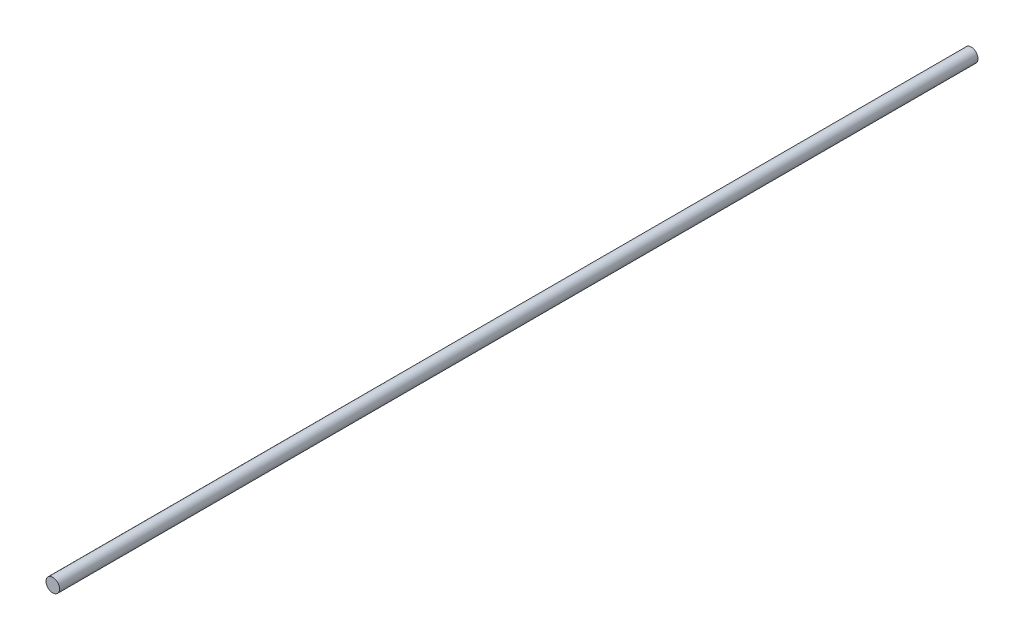
ISO-10303-21;
HEADER;
FILE_DESCRIPTION(('STEP AP214'),'2;1');
FILE_NAME('part.step','',(''),(''),'','','');
FILE_SCHEMA(('AUTOMOTIVE_DESIGN { 1 0 10303 214 1 1 1 1 }'));
ENDSEC;
DATA;
#1=APPLICATION_CONTEXT('core data for automotive mechanical design processes');
#2=APPLICATION_PROTOCOL_DEFINITION('international standard','automotive_design',2000,#1);
#3=PRODUCT_CONTEXT('',#1,'mechanical');
#4=PRODUCT('Part','Part','',(#3));
#5=PRODUCT_RELATED_PRODUCT_CATEGORY('part','',(#4));
#6=PRODUCT_DEFINITION_FORMATION('','',#4);
#7=PRODUCT_DEFINITION_CONTEXT('part definition',#1,'design');
#8=PRODUCT_DEFINITION('design','',#6,#7);
#9=PRODUCT_DEFINITION_SHAPE('','',#8);
#10=(LENGTH_UNIT() NAMED_UNIT(*) SI_UNIT(.MILLI.,.METRE.));
#11=(NAMED_UNIT(*) PLANE_ANGLE_UNIT() SI_UNIT($,.RADIAN.));
#12=(NAMED_UNIT(*) SI_UNIT($,.STERADIAN.) SOLID_ANGLE_UNIT());
#13=UNCERTAINTY_MEASURE_WITH_UNIT(LENGTH_MEASURE(1.E-05),#10,'distance_accuracy_value','');
#14=(GEOMETRIC_REPRESENTATION_CONTEXT(3) GLOBAL_UNCERTAINTY_ASSIGNED_CONTEXT((#13)) GLOBAL_UNIT_ASSIGNED_CONTEXT((#10,
#11,#12)) REPRESENTATION_CONTEXT('',''));
#15=CARTESIAN_POINT('',(0.,0.,0.));
#16=DIRECTION('',(0.,0.,1.));
#17=DIRECTION('',(1.,0.,0.));
#18=AXIS2_PLACEMENT_3D('',#15,#16,#17);
#19=CARTESIAN_POINT('',(-7.14018563469935,7.6610404533529,583.));
#20=DIRECTION('',(0.,0.,-1.));
#21=DIRECTION('',(-1.,0.,0.));
#22=AXIS2_PLACEMENT_3D('',#19,#20,#21);
#23=CYLINDRICAL_SURFACE('',#22,4.3);
#24=CARTESIAN_POINT('',(-7.14018563469935,7.6610404533529,583.));
#25=DIRECTION('',(0.,0.,1.));
#26=DIRECTION('',(1.,0.,0.));
#27=AXIS2_PLACEMENT_3D('',#24,#25,#26);
#28=CIRCLE('',#27,4.3);
#29=CARTESIAN_POINT('',(-2.84018563469935,7.6610404533529,583.));
#30=VERTEX_POINT('',#29);
#31=EDGE_CURVE('E10',#30,#30,#28,.T.);
#32=ORIENTED_EDGE('',*,*,#31,.F.);
#33=EDGE_LOOP('',(#32));
#34=FACE_BOUND('',#33,.T.);
#35=CARTESIAN_POINT('',(-7.14018563469935,7.6610404533529,0.));
#36=DIRECTION('',(0.,0.,1.));
#37=DIRECTION('',(1.,0.,0.));
#38=AXIS2_PLACEMENT_3D('',#35,#36,#37);
#39=CIRCLE('',#38,4.3);
#40=CARTESIAN_POINT('',(-2.84018563469935,7.6610404533529,0.));
#41=VERTEX_POINT('',#40);
#42=EDGE_CURVE('E38',#41,#41,#39,.T.);
#43=ORIENTED_EDGE('',*,*,#42,.T.);
#44=EDGE_LOOP('',(#43));
#45=FACE_BOUND('',#44,.T.);
#46=ADVANCED_FACE('F35',(#34,#45),#23,.T.);
#47=CARTESIAN_POINT('',(-7.14018563469935,7.6610404533529,583.));
#48=DIRECTION('',(0.,0.,1.));
#49=DIRECTION('',(1.,0.,0.));
#50=AXIS2_PLACEMENT_3D('',#47,#48,#49);
#51=PLANE('',#50);
#52=ORIENTED_EDGE('',*,*,#31,.T.);
#53=EDGE_LOOP('',(#52));
#54=FACE_BOUND('',#53,.T.);
#55=ADVANCED_FACE('F50',(#54),#51,.T.);
#56=CARTESIAN_POINT('',(-7.14018563469935,7.6610404533529,0.));
#57=DIRECTION('',(0.,0.,1.));
#58=DIRECTION('',(1.,0.,0.));
#59=AXIS2_PLACEMENT_3D('',#56,#57,#58);
#60=PLANE('',#59);
#61=ORIENTED_EDGE('',*,*,#42,.F.);
#62=EDGE_LOOP('',(#61));
#63=FACE_BOUND('',#62,.T.);
#64=ADVANCED_FACE('F48',(#63),#60,.F.);
#65=CLOSED_SHELL('',(#46,#55,#64));
#66=MANIFOLD_SOLID_BREP('B2',#65);
#67=ADVANCED_BREP_SHAPE_REPRESENTATION('',(#18,#66),#14);
#68=SHAPE_DEFINITION_REPRESENTATION(#9,#67);
ENDSEC;
END-ISO-10303-21;
